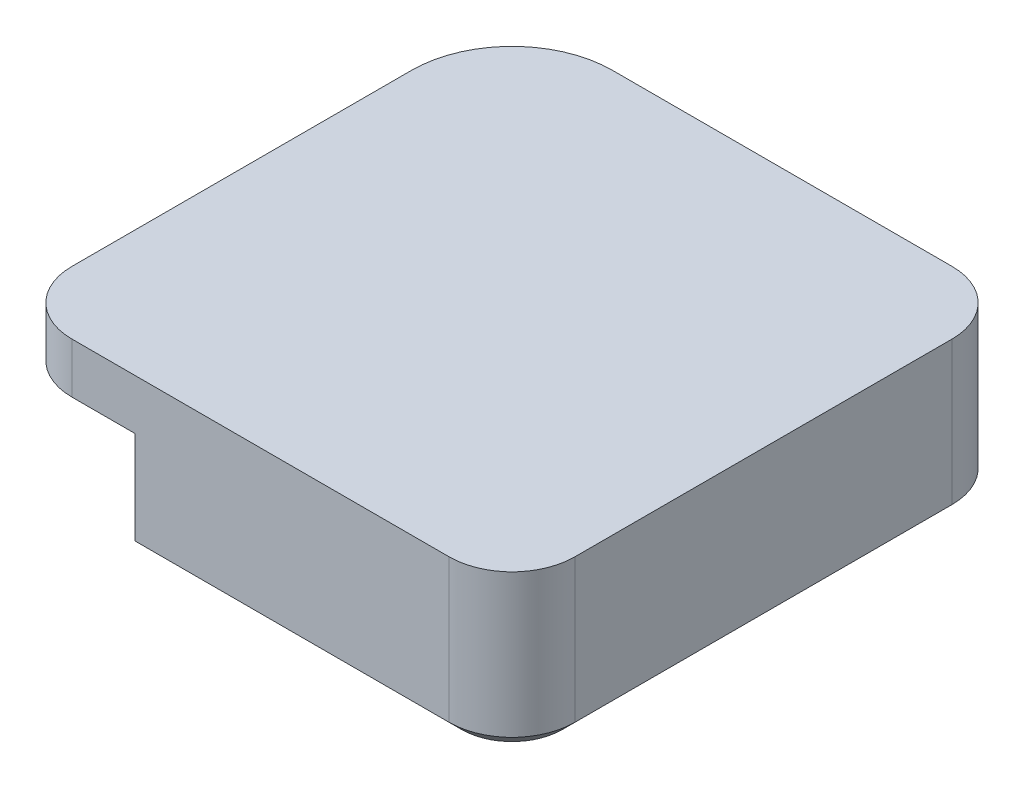
ISO-10303-21;
HEADER;
FILE_DESCRIPTION(('STEP AP214'),'2;1');
FILE_NAME('part.step','',(''),(''),'','','');
FILE_SCHEMA(('AUTOMOTIVE_DESIGN { 1 0 10303 214 1 1 1 1 }'));
ENDSEC;
DATA;
#1=APPLICATION_CONTEXT('core data for automotive mechanical design processes');
#2=APPLICATION_PROTOCOL_DEFINITION('international standard','automotive_design',2000,#1);
#3=PRODUCT_CONTEXT('',#1,'mechanical');
#4=PRODUCT('Part','Part','',(#3));
#5=PRODUCT_RELATED_PRODUCT_CATEGORY('part','',(#4));
#6=PRODUCT_DEFINITION_FORMATION('','',#4);
#7=PRODUCT_DEFINITION_CONTEXT('part definition',#1,'design');
#8=PRODUCT_DEFINITION('design','',#6,#7);
#9=PRODUCT_DEFINITION_SHAPE('','',#8);
#10=(LENGTH_UNIT() NAMED_UNIT(*) SI_UNIT(.MILLI.,.METRE.));
#11=(NAMED_UNIT(*) PLANE_ANGLE_UNIT() SI_UNIT($,.RADIAN.));
#12=(NAMED_UNIT(*) SI_UNIT($,.STERADIAN.) SOLID_ANGLE_UNIT());
#13=UNCERTAINTY_MEASURE_WITH_UNIT(LENGTH_MEASURE(1.E-05),#10,'distance_accuracy_value','');
#14=(GEOMETRIC_REPRESENTATION_CONTEXT(3) GLOBAL_UNCERTAINTY_ASSIGNED_CONTEXT((#13)) GLOBAL_UNIT_ASSIGNED_CONTEXT((#10,
#11,#12)) REPRESENTATION_CONTEXT('',''));
#15=CARTESIAN_POINT('',(0.,0.,0.));
#16=DIRECTION('',(0.,0.,1.));
#17=DIRECTION('',(1.,0.,0.));
#18=AXIS2_PLACEMENT_3D('',#15,#16,#17);
#19=CARTESIAN_POINT('',(0.,4.2,-20.));
#20=DIRECTION('',(0.,0.,-1.));
#21=DIRECTION('',(-1.,0.,0.));
#22=AXIS2_PLACEMENT_3D('',#19,#20,#21);
#23=PLANE('',#22);
#24=DIRECTION('',(0.,-1.,0.));
#25=VECTOR('',#24,1.);
#26=CARTESIAN_POINT('',(17.5,4.2,-20.));
#27=LINE('',#26,#25);
#28=CARTESIAN_POINT('',(17.5,6.2,-20.));
#29=VERTEX_POINT('',#28);
#30=CARTESIAN_POINT('',(17.5,0.5,-20.));
#31=VERTEX_POINT('',#30);
#32=EDGE_CURVE('E198',#29,#31,#27,.T.);
#33=ORIENTED_EDGE('',*,*,#32,.T.);
#34=DIRECTION('',(-1.,0.,0.));
#35=VECTOR('',#34,1.);
#36=CARTESIAN_POINT('',(4.,0.5,-20.));
#37=LINE('',#36,#35);
#38=CARTESIAN_POINT('',(4.,0.5,-20.));
#39=VERTEX_POINT('',#38);
#40=EDGE_CURVE('E272',#31,#39,#37,.T.);
#41=ORIENTED_EDGE('',*,*,#40,.T.);
#42=DIRECTION('',(0.,-1.,0.));
#43=VECTOR('',#42,1.);
#44=CARTESIAN_POINT('',(4.,4.2,-20.));
#45=LINE('',#44,#43);
#46=CARTESIAN_POINT('',(4.,6.2,-20.));
#47=VERTEX_POINT('',#46);
#48=EDGE_CURVE('E215',#47,#39,#45,.T.);
#49=ORIENTED_EDGE('',*,*,#48,.F.);
#50=DIRECTION('',(-1.,0.,0.));
#51=VECTOR('',#50,1.);
#52=CARTESIAN_POINT('',(4.,6.2,-20.));
#53=LINE('',#52,#51);
#54=EDGE_CURVE('E326',#29,#47,#53,.T.);
#55=ORIENTED_EDGE('',*,*,#54,.F.);
#56=EDGE_LOOP('',(#33,#41,#49,#55));
#57=FACE_BOUND('',#56,.T.);
#58=ADVANCED_FACE('F36',(#57),#23,.T.);
#59=CARTESIAN_POINT('',(4.,4.2,-16.));
#60=DIRECTION('',(0.,-1.,0.));
#61=DIRECTION('',(0.,0.,-1.));
#62=AXIS2_PLACEMENT_3D('',#59,#60,#61);
#63=CYLINDRICAL_SURFACE('',#62,4.);
#64=ORIENTED_EDGE('',*,*,#48,.T.);
#65=CARTESIAN_POINT('',(4.,0.5,-16.));
#66=DIRECTION('',(0.,1.,0.));
#67=DIRECTION('',(0.,0.,1.));
#68=AXIS2_PLACEMENT_3D('',#65,#66,#67);
#69=CIRCLE('',#68,4.);
#70=CARTESIAN_POINT('',(0.,0.5,-16.));
#71=VERTEX_POINT('',#70);
#72=EDGE_CURVE('E218',#39,#71,#69,.T.);
#73=ORIENTED_EDGE('',*,*,#72,.T.);
#74=DIRECTION('',(0.,-1.,0.));
#75=VECTOR('',#74,1.);
#76=CARTESIAN_POINT('',(0.,4.2,-16.));
#77=LINE('',#76,#75);
#78=CARTESIAN_POINT('',(0.,6.2,-16.));
#79=VERTEX_POINT('',#78);
#80=EDGE_CURVE('E213',#79,#71,#77,.T.);
#81=ORIENTED_EDGE('',*,*,#80,.F.);
#82=CARTESIAN_POINT('',(4.,6.2,-16.));
#83=DIRECTION('',(0.,1.,0.));
#84=DIRECTION('',(0.,0.,1.));
#85=AXIS2_PLACEMENT_3D('',#82,#83,#84);
#86=CIRCLE('',#85,4.);
#87=EDGE_CURVE('E159',#47,#79,#86,.T.);
#88=ORIENTED_EDGE('',*,*,#87,.F.);
#89=EDGE_LOOP('',(#64,#73,#81,#88));
#90=FACE_BOUND('',#89,.T.);
#91=ADVANCED_FACE('F362',(#90),#63,.T.);
#92=CARTESIAN_POINT('',(0.,4.2,0.));
#93=DIRECTION('',(-1.,0.,0.));
#94=DIRECTION('',(0.,0.,1.));
#95=AXIS2_PLACEMENT_3D('',#92,#93,#94);
#96=PLANE('',#95);
#97=ORIENTED_EDGE('',*,*,#80,.T.);
#98=DIRECTION('',(0.,0.,1.));
#99=VECTOR('',#98,1.);
#100=CARTESIAN_POINT('',(0.,0.5,-5.));
#101=LINE('',#100,#99);
#102=CARTESIAN_POINT('',(0.,0.5,-5.));
#103=VERTEX_POINT('',#102);
#104=EDGE_CURVE('E262',#71,#103,#101,.T.);
#105=ORIENTED_EDGE('',*,*,#104,.T.);
#106=DIRECTION('',(0.,-1.,0.));
#107=VECTOR('',#106,1.);
#108=CARTESIAN_POINT('',(0.,4.2,-5.));
#109=LINE('',#108,#107);
#110=CARTESIAN_POINT('',(0.,4.2,-5.));
#111=VERTEX_POINT('',#110);
#112=EDGE_CURVE('E210',#111,#103,#109,.T.);
#113=ORIENTED_EDGE('',*,*,#112,.F.);
#114=DIRECTION('',(0.,0.,1.));
#115=VECTOR('',#114,1.);
#116=CARTESIAN_POINT('',(0.,4.2,-5.));
#117=LINE('',#116,#115);
#118=CARTESIAN_POINT('',(0.,4.2,-2.50000000000002));
#119=VERTEX_POINT('',#118);
#120=EDGE_CURVE('E162',#111,#119,#117,.T.);
#121=ORIENTED_EDGE('',*,*,#120,.T.);
#122=DIRECTION('',(0.,-1.,0.));
#123=VECTOR('',#122,1.);
#124=CARTESIAN_POINT('',(0.,6.2,-2.50000000000002));
#125=LINE('',#124,#123);
#126=CARTESIAN_POINT('',(0.,6.2,-2.50000000000002));
#127=VERTEX_POINT('',#126);
#128=EDGE_CURVE('E145',#127,#119,#125,.T.);
#129=ORIENTED_EDGE('',*,*,#128,.F.);
#130=DIRECTION('',(0.,0.,1.));
#131=VECTOR('',#130,1.);
#132=CARTESIAN_POINT('',(0.,6.2,-2.50000000000002));
#133=LINE('',#132,#131);
#134=EDGE_CURVE('E152',#79,#127,#133,.T.);
#135=ORIENTED_EDGE('',*,*,#134,.F.);
#136=EDGE_LOOP('',(#97,#105,#113,#121,#129,#135));
#137=FACE_BOUND('',#136,.T.);
#138=ADVANCED_FACE('F164',(#137),#96,.T.);
#139=CARTESIAN_POINT('',(2.5,4.2,-2.5));
#140=DIRECTION('',(-0.707106781186548,0.,0.707106781186548));
#141=DIRECTION('',(0.707106781186548,0.,0.707106781186548));
#142=AXIS2_PLACEMENT_3D('',#139,#140,#141);
#143=PLANE('',#142);
#144=ORIENTED_EDGE('',*,*,#112,.T.);
#145=DIRECTION('',(0.707106781186548,0.,0.707106781186548));
#146=VECTOR('',#145,1.);
#147=CARTESIAN_POINT('',(5.,0.5,0.));
#148=LINE('',#147,#146);
#149=CARTESIAN_POINT('',(5.,0.5,0.));
#150=VERTEX_POINT('',#149);
#151=EDGE_CURVE('E264',#103,#150,#148,.T.);
#152=ORIENTED_EDGE('',*,*,#151,.T.);
#153=DIRECTION('',(0.,-1.,0.));
#154=VECTOR('',#153,1.);
#155=CARTESIAN_POINT('',(5.,4.2,0.));
#156=LINE('',#155,#154);
#157=CARTESIAN_POINT('',(5.00000000000001,4.2,0.));
#158=VERTEX_POINT('',#157);
#159=EDGE_CURVE('E207',#158,#150,#156,.T.);
#160=ORIENTED_EDGE('',*,*,#159,.F.);
#161=DIRECTION('',(-0.707106781186548,0.,-0.707106781186548));
#162=VECTOR('',#161,1.);
#163=CARTESIAN_POINT('',(2.5,4.2,-2.5));
#164=LINE('',#163,#162);
#165=EDGE_CURVE('E178',#158,#111,#164,.T.);
#166=ORIENTED_EDGE('',*,*,#165,.T.);
#167=EDGE_LOOP('',(#144,#152,#160,#166));
#168=FACE_BOUND('',#167,.T.);
#169=ADVANCED_FACE('F368',(#168),#143,.T.);
#170=CARTESIAN_POINT('',(0.,4.2,0.));
#171=DIRECTION('',(0.,0.,-1.));
#172=DIRECTION('',(-1.,0.,0.));
#173=AXIS2_PLACEMENT_3D('',#170,#171,#172);
#174=PLANE('',#173);
#175=ORIENTED_EDGE('',*,*,#159,.T.);
#176=DIRECTION('',(1.,0.,0.));
#177=VECTOR('',#176,1.);
#178=CARTESIAN_POINT('',(0.,0.5,0.));
#179=LINE('',#178,#177);
#180=CARTESIAN_POINT('',(17.5,0.5,0.));
#181=VERTEX_POINT('',#180);
#182=EDGE_CURVE('E266',#150,#181,#179,.T.);
#183=ORIENTED_EDGE('',*,*,#182,.T.);
#184=DIRECTION('',(0.,-1.,0.));
#185=VECTOR('',#184,1.);
#186=CARTESIAN_POINT('',(17.5,4.2,0.));
#187=LINE('',#186,#185);
#188=CARTESIAN_POINT('',(17.5,6.2,0.));
#189=VERTEX_POINT('',#188);
#190=EDGE_CURVE('E204',#189,#181,#187,.T.);
#191=ORIENTED_EDGE('',*,*,#190,.F.);
#192=DIRECTION('',(1.,0.,0.));
#193=VECTOR('',#192,1.);
#194=CARTESIAN_POINT('',(17.5,6.2,0.));
#195=LINE('',#194,#193);
#196=CARTESIAN_POINT('',(2.50000000000002,6.2,0.));
#197=VERTEX_POINT('',#196);
#198=EDGE_CURVE('E151',#197,#189,#195,.T.);
#199=ORIENTED_EDGE('',*,*,#198,.F.);
#200=DIRECTION('',(0.,-1.,0.));
#201=VECTOR('',#200,1.);
#202=CARTESIAN_POINT('',(2.50000000000002,6.2,0.));
#203=LINE('',#202,#201);
#204=CARTESIAN_POINT('',(2.50000000000002,4.2,0.));
#205=VERTEX_POINT('',#204);
#206=EDGE_CURVE('E147',#197,#205,#203,.T.);
#207=ORIENTED_EDGE('',*,*,#206,.T.);
#208=DIRECTION('',(1.,0.,0.));
#209=VECTOR('',#208,1.);
#210=CARTESIAN_POINT('',(17.5,4.2,0.));
#211=LINE('',#210,#209);
#212=EDGE_CURVE('E320',#205,#158,#211,.T.);
#213=ORIENTED_EDGE('',*,*,#212,.T.);
#214=EDGE_LOOP('',(#175,#183,#191,#199,#207,#213));
#215=FACE_BOUND('',#214,.T.);
#216=ADVANCED_FACE('F384',(#215),#174,.F.);
#217=CARTESIAN_POINT('',(17.5,4.2,-2.5));
#218=DIRECTION('',(0.,-1.,0.));
#219=DIRECTION('',(0.,0.,-1.));
#220=AXIS2_PLACEMENT_3D('',#217,#218,#219);
#221=CYLINDRICAL_SURFACE('',#220,2.5);
#222=ORIENTED_EDGE('',*,*,#190,.T.);
#223=CARTESIAN_POINT('',(17.5,0.5,-2.5));
#224=DIRECTION('',(0.,1.,0.));
#225=DIRECTION('',(0.,0.,1.));
#226=AXIS2_PLACEMENT_3D('',#223,#224,#225);
#227=CIRCLE('',#226,2.5);
#228=CARTESIAN_POINT('',(20.,0.5,-2.50000000000002));
#229=VERTEX_POINT('',#228);
#230=EDGE_CURVE('E268',#181,#229,#227,.T.);
#231=ORIENTED_EDGE('',*,*,#230,.T.);
#232=DIRECTION('',(0.,-1.,0.));
#233=VECTOR('',#232,1.);
#234=CARTESIAN_POINT('',(20.,4.2,-2.50000000000002));
#235=LINE('',#234,#233);
#236=CARTESIAN_POINT('',(20.,6.2,-2.50000000000002));
#237=VERTEX_POINT('',#236);
#238=EDGE_CURVE('E202',#237,#229,#235,.T.);
#239=ORIENTED_EDGE('',*,*,#238,.F.);
#240=CARTESIAN_POINT('',(17.5,6.2,-2.5));
#241=DIRECTION('',(0.,1.,0.));
#242=DIRECTION('',(0.,0.,1.));
#243=AXIS2_PLACEMENT_3D('',#240,#241,#242);
#244=CIRCLE('',#243,2.5);
#245=EDGE_CURVE('E334',#189,#237,#244,.T.);
#246=ORIENTED_EDGE('',*,*,#245,.F.);
#247=EDGE_LOOP('',(#222,#231,#239,#246));
#248=FACE_BOUND('',#247,.T.);
#249=ADVANCED_FACE('F341',(#248),#221,.T.);
#250=CARTESIAN_POINT('',(20.,4.2,0.));
#251=DIRECTION('',(-1.,0.,0.));
#252=DIRECTION('',(0.,0.,1.));
#253=AXIS2_PLACEMENT_3D('',#250,#251,#252);
#254=PLANE('',#253);
#255=ORIENTED_EDGE('',*,*,#238,.T.);
#256=DIRECTION('',(0.,0.,-1.));
#257=VECTOR('',#256,1.);
#258=CARTESIAN_POINT('',(20.,0.5,0.));
#259=LINE('',#258,#257);
#260=CARTESIAN_POINT('',(20.,0.5,-17.5));
#261=VERTEX_POINT('',#260);
#262=EDGE_CURVE('E62',#229,#261,#259,.T.);
#263=ORIENTED_EDGE('',*,*,#262,.T.);
#264=DIRECTION('',(0.,-1.,0.));
#265=VECTOR('',#264,1.);
#266=CARTESIAN_POINT('',(20.,4.2,-17.5));
#267=LINE('',#266,#265);
#268=CARTESIAN_POINT('',(20.,6.2,-17.5));
#269=VERTEX_POINT('',#268);
#270=EDGE_CURVE('E200',#269,#261,#267,.T.);
#271=ORIENTED_EDGE('',*,*,#270,.F.);
#272=DIRECTION('',(0.,0.,-1.));
#273=VECTOR('',#272,1.);
#274=CARTESIAN_POINT('',(20.,6.2,-17.5));
#275=LINE('',#274,#273);
#276=EDGE_CURVE('E331',#237,#269,#275,.T.);
#277=ORIENTED_EDGE('',*,*,#276,.F.);
#278=EDGE_LOOP('',(#255,#263,#271,#277));
#279=FACE_BOUND('',#278,.T.);
#280=ADVANCED_FACE('F343',(#279),#254,.F.);
#281=CARTESIAN_POINT('',(4.,4.2,-16.));
#282=DIRECTION('',(0.,-1.,0.));
#283=DIRECTION('',(0.,0.,-1.));
#284=AXIS2_PLACEMENT_3D('',#281,#282,#283);
#285=CYLINDRICAL_SURFACE('',#284,1.75);
#286=CARTESIAN_POINT('',(4.,0.500000000000002,-16.));
#287=DIRECTION('',(0.,1.,0.));
#288=DIRECTION('',(0.,0.,1.));
#289=AXIS2_PLACEMENT_3D('',#286,#287,#288);
#290=CIRCLE('',#289,1.75);
#291=CARTESIAN_POINT('',(4.,0.500000000000002,-14.25));
#292=VERTEX_POINT('',#291);
#293=EDGE_CURVE('E274',#292,#292,#290,.F.);
#294=ORIENTED_EDGE('',*,*,#293,.T.);
#295=EDGE_LOOP('',(#294));
#296=FACE_BOUND('',#295,.T.);
#297=CARTESIAN_POINT('',(4.,4.2,-16.));
#298=DIRECTION('',(0.,1.,0.));
#299=DIRECTION('',(0.,0.,1.));
#300=AXIS2_PLACEMENT_3D('',#297,#298,#299);
#301=CIRCLE('',#300,1.75);
#302=CARTESIAN_POINT('',(4.,4.2,-14.25));
#303=VERTEX_POINT('',#302);
#304=EDGE_CURVE('E167',#303,#303,#301,.T.);
#305=ORIENTED_EDGE('',*,*,#304,.T.);
#306=EDGE_LOOP('',(#305));
#307=FACE_BOUND('',#306,.T.);
#308=ADVANCED_FACE('F414',(#296,#307),#285,.F.);
#309=CARTESIAN_POINT('',(10.,4.2,-16.));
#310=DIRECTION('',(0.,-1.,0.));
#311=DIRECTION('',(0.,0.,-1.));
#312=AXIS2_PLACEMENT_3D('',#309,#310,#311);
#313=CYLINDRICAL_SURFACE('',#312,1.8);
#314=CARTESIAN_POINT('',(10.,0.500000000000003,-16.));
#315=DIRECTION('',(0.,1.,0.));
#316=DIRECTION('',(0.,0.,1.));
#317=AXIS2_PLACEMENT_3D('',#314,#315,#316);
#318=CIRCLE('',#317,1.8);
#319=CARTESIAN_POINT('',(10.,0.500000000000003,-14.2));
#320=VERTEX_POINT('',#319);
#321=EDGE_CURVE('E277',#320,#320,#318,.F.);
#322=ORIENTED_EDGE('',*,*,#321,.T.);
#323=EDGE_LOOP('',(#322));
#324=FACE_BOUND('',#323,.T.);
#325=CARTESIAN_POINT('',(10.,4.2,-16.));
#326=DIRECTION('',(0.,1.,0.));
#327=DIRECTION('',(0.,0.,1.));
#328=AXIS2_PLACEMENT_3D('',#325,#326,#327);
#329=CIRCLE('',#328,1.8);
#330=CARTESIAN_POINT('',(10.,4.2,-14.2));
#331=VERTEX_POINT('',#330);
#332=EDGE_CURVE('E170',#331,#331,#329,.T.);
#333=ORIENTED_EDGE('',*,*,#332,.T.);
#334=EDGE_LOOP('',(#333));
#335=FACE_BOUND('',#334,.T.);
#336=ADVANCED_FACE('F417',(#324,#335),#313,.F.);
#337=CARTESIAN_POINT('',(16.,4.2,-16.));
#338=DIRECTION('',(0.,-1.,0.));
#339=DIRECTION('',(0.,0.,-1.));
#340=AXIS2_PLACEMENT_3D('',#337,#338,#339);
#341=CYLINDRICAL_SURFACE('',#340,1.85);
#342=CARTESIAN_POINT('',(16.,0.500000000000002,-16.));
#343=DIRECTION('',(0.,1.,0.));
#344=DIRECTION('',(0.,0.,1.));
#345=AXIS2_PLACEMENT_3D('',#342,#343,#344);
#346=CIRCLE('',#345,1.85);
#347=CARTESIAN_POINT('',(16.,0.500000000000002,-14.15));
#348=VERTEX_POINT('',#347);
#349=EDGE_CURVE('E280',#348,#348,#346,.F.);
#350=ORIENTED_EDGE('',*,*,#349,.T.);
#351=EDGE_LOOP('',(#350));
#352=FACE_BOUND('',#351,.T.);
#353=CARTESIAN_POINT('',(16.,4.2,-16.));
#354=DIRECTION('',(0.,1.,0.));
#355=DIRECTION('',(0.,0.,1.));
#356=AXIS2_PLACEMENT_3D('',#353,#354,#355);
#357=CIRCLE('',#356,1.85);
#358=CARTESIAN_POINT('',(16.,4.2,-14.15));
#359=VERTEX_POINT('',#358);
#360=EDGE_CURVE('E191',#359,#359,#357,.T.);
#361=ORIENTED_EDGE('',*,*,#360,.T.);
#362=EDGE_LOOP('',(#361));
#363=FACE_BOUND('',#362,.T.);
#364=ADVANCED_FACE('F421',(#352,#363),#341,.F.);
#365=CARTESIAN_POINT('',(4.,4.2,-10.));
#366=DIRECTION('',(0.,-1.,0.));
#367=DIRECTION('',(0.,0.,-1.));
#368=AXIS2_PLACEMENT_3D('',#365,#366,#367);
#369=CYLINDRICAL_SURFACE('',#368,1.9);
#370=CARTESIAN_POINT('',(4.,0.500000000000006,-10.));
#371=DIRECTION('',(0.,1.,0.));
#372=DIRECTION('',(0.,0.,1.));
#373=AXIS2_PLACEMENT_3D('',#370,#371,#372);
#374=CIRCLE('',#373,1.9);
#375=CARTESIAN_POINT('',(4.,0.500000000000006,-8.1));
#376=VERTEX_POINT('',#375);
#377=EDGE_CURVE('E283',#376,#376,#374,.F.);
#378=ORIENTED_EDGE('',*,*,#377,.T.);
#379=EDGE_LOOP('',(#378));
#380=FACE_BOUND('',#379,.T.);
#381=CARTESIAN_POINT('',(4.,4.2,-10.));
#382=DIRECTION('',(0.,1.,0.));
#383=DIRECTION('',(0.,0.,1.));
#384=AXIS2_PLACEMENT_3D('',#381,#382,#383);
#385=CIRCLE('',#384,1.9);
#386=CARTESIAN_POINT('',(4.,4.2,-8.1));
#387=VERTEX_POINT('',#386);
#388=EDGE_CURVE('E188',#387,#387,#385,.T.);
#389=ORIENTED_EDGE('',*,*,#388,.T.);
#390=EDGE_LOOP('',(#389));
#391=FACE_BOUND('',#390,.T.);
#392=ADVANCED_FACE('F425',(#380,#391),#369,.F.);
#393=CARTESIAN_POINT('',(10.,4.2,-10.));
#394=DIRECTION('',(0.,-1.,0.));
#395=DIRECTION('',(0.,0.,-1.));
#396=AXIS2_PLACEMENT_3D('',#393,#394,#395);
#397=CYLINDRICAL_SURFACE('',#396,1.95);
#398=CARTESIAN_POINT('',(10.,0.500000000000004,-10.));
#399=DIRECTION('',(0.,1.,0.));
#400=DIRECTION('',(0.,0.,1.));
#401=AXIS2_PLACEMENT_3D('',#398,#399,#400);
#402=CIRCLE('',#401,1.95);
#403=CARTESIAN_POINT('',(10.,0.500000000000004,-8.05));
#404=VERTEX_POINT('',#403);
#405=EDGE_CURVE('E286',#404,#404,#402,.F.);
#406=ORIENTED_EDGE('',*,*,#405,.T.);
#407=EDGE_LOOP('',(#406));
#408=FACE_BOUND('',#407,.T.);
#409=CARTESIAN_POINT('',(10.,4.2,-10.));
#410=DIRECTION('',(0.,1.,0.));
#411=DIRECTION('',(0.,0.,1.));
#412=AXIS2_PLACEMENT_3D('',#409,#410,#411);
#413=CIRCLE('',#412,1.95);
#414=CARTESIAN_POINT('',(10.,4.2,-8.05));
#415=VERTEX_POINT('',#414);
#416=EDGE_CURVE('E185',#415,#415,#413,.T.);
#417=ORIENTED_EDGE('',*,*,#416,.T.);
#418=EDGE_LOOP('',(#417));
#419=FACE_BOUND('',#418,.T.);
#420=ADVANCED_FACE('F429',(#408,#419),#397,.F.);
#421=CARTESIAN_POINT('',(16.,4.2,-10.));
#422=DIRECTION('',(0.,-1.,0.));
#423=DIRECTION('',(0.,0.,-1.));
#424=AXIS2_PLACEMENT_3D('',#421,#422,#423);
#425=CYLINDRICAL_SURFACE('',#424,2.);
#426=CARTESIAN_POINT('',(16.,0.500000000000003,-10.));
#427=DIRECTION('',(0.,1.,0.));
#428=DIRECTION('',(0.,0.,1.));
#429=AXIS2_PLACEMENT_3D('',#426,#427,#428);
#430=CIRCLE('',#429,2.);
#431=CARTESIAN_POINT('',(16.,0.500000000000003,-8.));
#432=VERTEX_POINT('',#431);
#433=EDGE_CURVE('E289',#432,#432,#430,.F.);
#434=ORIENTED_EDGE('',*,*,#433,.T.);
#435=EDGE_LOOP('',(#434));
#436=FACE_BOUND('',#435,.T.);
#437=CARTESIAN_POINT('',(16.,4.2,-10.));
#438=DIRECTION('',(0.,1.,0.));
#439=DIRECTION('',(0.,0.,1.));
#440=AXIS2_PLACEMENT_3D('',#437,#438,#439);
#441=CIRCLE('',#440,2.);
#442=CARTESIAN_POINT('',(16.,4.2,-8.));
#443=VERTEX_POINT('',#442);
#444=EDGE_CURVE('E182',#443,#443,#441,.T.);
#445=ORIENTED_EDGE('',*,*,#444,.T.);
#446=EDGE_LOOP('',(#445));
#447=FACE_BOUND('',#446,.T.);
#448=ADVANCED_FACE('F433',(#436,#447),#425,.F.);
#449=CARTESIAN_POINT('',(10.,4.2,-4.));
#450=DIRECTION('',(0.,-1.,0.));
#451=DIRECTION('',(0.,0.,-1.));
#452=AXIS2_PLACEMENT_3D('',#449,#450,#451);
#453=CYLINDRICAL_SURFACE('',#452,2.05);
#454=CARTESIAN_POINT('',(10.,0.500000000000003,-4.));
#455=DIRECTION('',(0.,1.,0.));
#456=DIRECTION('',(0.,0.,1.));
#457=AXIS2_PLACEMENT_3D('',#454,#455,#456);
#458=CIRCLE('',#457,2.05);
#459=CARTESIAN_POINT('',(10.,0.500000000000003,-1.95));
#460=VERTEX_POINT('',#459);
#461=EDGE_CURVE('E46',#460,#460,#458,.F.);
#462=ORIENTED_EDGE('',*,*,#461,.T.);
#463=EDGE_LOOP('',(#462));
#464=FACE_BOUND('',#463,.T.);
#465=CARTESIAN_POINT('',(10.,4.2,-4.));
#466=DIRECTION('',(0.,1.,0.));
#467=DIRECTION('',(0.,0.,1.));
#468=AXIS2_PLACEMENT_3D('',#465,#466,#467);
#469=CIRCLE('',#468,2.05);
#470=CARTESIAN_POINT('',(10.,4.2,-1.95));
#471=VERTEX_POINT('',#470);
#472=EDGE_CURVE('E179',#471,#471,#469,.T.);
#473=ORIENTED_EDGE('',*,*,#472,.T.);
#474=EDGE_LOOP('',(#473));
#475=FACE_BOUND('',#474,.T.);
#476=ADVANCED_FACE('F437',(#464,#475),#453,.F.);
#477=CARTESIAN_POINT('',(16.,4.2,-4.));
#478=DIRECTION('',(0.,-1.,0.));
#479=DIRECTION('',(0.,0.,-1.));
#480=AXIS2_PLACEMENT_3D('',#477,#478,#479);
#481=CYLINDRICAL_SURFACE('',#480,2.1);
#482=CARTESIAN_POINT('',(16.,0.500000000000004,-4.));
#483=DIRECTION('',(0.,1.,0.));
#484=DIRECTION('',(0.,0.,1.));
#485=AXIS2_PLACEMENT_3D('',#482,#483,#484);
#486=CIRCLE('',#485,2.1);
#487=CARTESIAN_POINT('',(16.,0.500000000000004,-1.9));
#488=VERTEX_POINT('',#487);
#489=EDGE_CURVE('E11',#488,#488,#486,.F.);
#490=ORIENTED_EDGE('',*,*,#489,.T.);
#491=EDGE_LOOP('',(#490));
#492=FACE_BOUND('',#491,.T.);
#493=CARTESIAN_POINT('',(16.,4.2,-4.));
#494=DIRECTION('',(0.,1.,0.));
#495=DIRECTION('',(0.,0.,1.));
#496=AXIS2_PLACEMENT_3D('',#493,#494,#495);
#497=CIRCLE('',#496,2.1);
#498=CARTESIAN_POINT('',(16.,4.2,-1.9));
#499=VERTEX_POINT('',#498);
#500=EDGE_CURVE('E175',#499,#499,#497,.T.);
#501=ORIENTED_EDGE('',*,*,#500,.T.);
#502=EDGE_LOOP('',(#501));
#503=FACE_BOUND('',#502,.T.);
#504=ADVANCED_FACE('F441',(#492,#503),#481,.F.);
#505=CARTESIAN_POINT('',(17.5,4.2,-17.5));
#506=DIRECTION('',(0.,-1.,0.));
#507=DIRECTION('',(0.,0.,-1.));
#508=AXIS2_PLACEMENT_3D('',#505,#506,#507);
#509=CYLINDRICAL_SURFACE('',#508,2.5);
#510=ORIENTED_EDGE('',*,*,#270,.T.);
#511=CARTESIAN_POINT('',(17.5,0.5,-17.5));
#512=DIRECTION('',(0.,1.,0.));
#513=DIRECTION('',(0.,0.,1.));
#514=AXIS2_PLACEMENT_3D('',#511,#512,#513);
#515=CIRCLE('',#514,2.5);
#516=EDGE_CURVE('E54',#261,#31,#515,.T.);
#517=ORIENTED_EDGE('',*,*,#516,.T.);
#518=ORIENTED_EDGE('',*,*,#32,.F.);
#519=CARTESIAN_POINT('',(17.5,6.2,-17.5));
#520=DIRECTION('',(0.,1.,0.));
#521=DIRECTION('',(0.,0.,-1.));
#522=AXIS2_PLACEMENT_3D('',#519,#520,#521);
#523=CIRCLE('',#522,2.5);
#524=EDGE_CURVE('E328',#269,#29,#523,.T.);
#525=ORIENTED_EDGE('',*,*,#524,.F.);
#526=EDGE_LOOP('',(#510,#517,#518,#525));
#527=FACE_BOUND('',#526,.T.);
#528=ADVANCED_FACE('F397',(#527),#509,.T.);
#529=CARTESIAN_POINT('',(0.,0.,0.));
#530=DIRECTION('',(0.,1.,0.));
#531=DIRECTION('',(0.,0.,1.));
#532=AXIS2_PLACEMENT_3D('',#529,#530,#531);
#533=PLANE('',#532);
#534=DIRECTION('',(0.,0.,-1.));
#535=VECTOR('',#534,1.);
#536=CARTESIAN_POINT('',(0.499999999999994,0.,-16.));
#537=LINE('',#536,#535);
#538=CARTESIAN_POINT('',(0.499999999999993,0.,-5.20710678118654));
#539=VERTEX_POINT('',#538);
#540=CARTESIAN_POINT('',(0.499999999999994,0.,-16.));
#541=VERTEX_POINT('',#540);
#542=EDGE_CURVE('E257',#539,#541,#537,.T.);
#543=ORIENTED_EDGE('',*,*,#542,.T.);
#544=CARTESIAN_POINT('',(4.,0.,-16.));
#545=DIRECTION('',(0.,1.,0.));
#546=DIRECTION('',(0.,0.,1.));
#547=AXIS2_PLACEMENT_3D('',#544,#545,#546);
#548=CIRCLE('',#547,3.50000000000001);
#549=CARTESIAN_POINT('',(4.,0.,-19.5));
#550=VERTEX_POINT('',#549);
#551=EDGE_CURVE('E259',#541,#550,#548,.F.);
#552=ORIENTED_EDGE('',*,*,#551,.T.);
#553=DIRECTION('',(1.,0.,0.));
#554=VECTOR('',#553,1.);
#555=CARTESIAN_POINT('',(17.5,0.,-19.5));
#556=LINE('',#555,#554);
#557=CARTESIAN_POINT('',(17.5,0.,-19.5));
#558=VERTEX_POINT('',#557);
#559=EDGE_CURVE('E245',#550,#558,#556,.T.);
#560=ORIENTED_EDGE('',*,*,#559,.T.);
#561=CARTESIAN_POINT('',(17.5,0.,-17.5));
#562=DIRECTION('',(0.,1.,0.));
#563=DIRECTION('',(0.,0.,1.));
#564=AXIS2_PLACEMENT_3D('',#561,#562,#563);
#565=CIRCLE('',#564,2.00000000000001);
#566=CARTESIAN_POINT('',(19.5,0.,-17.5));
#567=VERTEX_POINT('',#566);
#568=EDGE_CURVE('E247',#558,#567,#565,.F.);
#569=ORIENTED_EDGE('',*,*,#568,.T.);
#570=DIRECTION('',(0.,0.,1.));
#571=VECTOR('',#570,1.);
#572=CARTESIAN_POINT('',(19.5,0.,0.));
#573=LINE('',#572,#571);
#574=CARTESIAN_POINT('',(19.5,0.,-2.50000000000001));
#575=VERTEX_POINT('',#574);
#576=EDGE_CURVE('E249',#567,#575,#573,.T.);
#577=ORIENTED_EDGE('',*,*,#576,.T.);
#578=CARTESIAN_POINT('',(17.5,0.,-2.5));
#579=DIRECTION('',(0.,1.,0.));
#580=DIRECTION('',(0.,0.,1.));
#581=AXIS2_PLACEMENT_3D('',#578,#579,#580);
#582=CIRCLE('',#581,2.00000000000001);
#583=CARTESIAN_POINT('',(17.5,0.,-0.499999999999994));
#584=VERTEX_POINT('',#583);
#585=EDGE_CURVE('E251',#575,#584,#582,.F.);
#586=ORIENTED_EDGE('',*,*,#585,.T.);
#587=DIRECTION('',(-1.,0.,0.));
#588=VECTOR('',#587,1.);
#589=CARTESIAN_POINT('',(0.,0.,-0.499999999999994));
#590=LINE('',#589,#588);
#591=CARTESIAN_POINT('',(5.20710678118654,0.,-0.499999999999994));
#592=VERTEX_POINT('',#591);
#593=EDGE_CURVE('E253',#584,#592,#590,.T.);
#594=ORIENTED_EDGE('',*,*,#593,.T.);
#595=DIRECTION('',(-0.707106781186548,0.,-0.707106781186548));
#596=VECTOR('',#595,1.);
#597=CARTESIAN_POINT('',(0.35355339059327,0.,-5.35355339059327));
#598=LINE('',#597,#596);
#599=EDGE_CURVE('E255',#592,#539,#598,.T.);
#600=ORIENTED_EDGE('',*,*,#599,.T.);
#601=EDGE_LOOP('',(#543,#552,#560,#569,#577,#586,#594,#600));
#602=FACE_BOUND('',#601,.T.);
#603=CARTESIAN_POINT('',(4.,0.,-16.));
#604=DIRECTION('',(0.,1.,0.));
#605=DIRECTION('',(0.,0.,1.));
#606=AXIS2_PLACEMENT_3D('',#603,#604,#605);
#607=CIRCLE('',#606,2.25);
#608=CARTESIAN_POINT('',(4.,0.,-13.75));
#609=VERTEX_POINT('',#608);
#610=EDGE_CURVE('E242',#609,#609,#607,.T.);
#611=ORIENTED_EDGE('',*,*,#610,.T.);
#612=EDGE_LOOP('',(#611));
#613=FACE_BOUND('',#612,.T.);
#614=CARTESIAN_POINT('',(10.,0.,-16.));
#615=DIRECTION('',(0.,1.,0.));
#616=DIRECTION('',(0.,0.,1.));
#617=AXIS2_PLACEMENT_3D('',#614,#615,#616);
#618=CIRCLE('',#617,2.3);
#619=CARTESIAN_POINT('',(10.,0.,-13.7));
#620=VERTEX_POINT('',#619);
#621=EDGE_CURVE('E239',#620,#620,#618,.T.);
#622=ORIENTED_EDGE('',*,*,#621,.T.);
#623=EDGE_LOOP('',(#622));
#624=FACE_BOUND('',#623,.T.);
#625=CARTESIAN_POINT('',(16.,0.,-16.));
#626=DIRECTION('',(0.,1.,0.));
#627=DIRECTION('',(0.,0.,1.));
#628=AXIS2_PLACEMENT_3D('',#625,#626,#627);
#629=CIRCLE('',#628,2.34999999999999);
#630=CARTESIAN_POINT('',(16.,0.,-13.65));
#631=VERTEX_POINT('',#630);
#632=EDGE_CURVE('E236',#631,#631,#629,.T.);
#633=ORIENTED_EDGE('',*,*,#632,.T.);
#634=EDGE_LOOP('',(#633));
#635=FACE_BOUND('',#634,.T.);
#636=CARTESIAN_POINT('',(4.,0.,-10.));
#637=DIRECTION('',(0.,1.,0.));
#638=DIRECTION('',(0.,0.,1.));
#639=AXIS2_PLACEMENT_3D('',#636,#637,#638);
#640=CIRCLE('',#639,2.4);
#641=CARTESIAN_POINT('',(4.,0.,-7.6));
#642=VERTEX_POINT('',#641);
#643=EDGE_CURVE('E233',#642,#642,#640,.T.);
#644=ORIENTED_EDGE('',*,*,#643,.T.);
#645=EDGE_LOOP('',(#644));
#646=FACE_BOUND('',#645,.T.);
#647=CARTESIAN_POINT('',(10.,0.,-10.));
#648=DIRECTION('',(0.,1.,0.));
#649=DIRECTION('',(0.,0.,1.));
#650=AXIS2_PLACEMENT_3D('',#647,#648,#649);
#651=CIRCLE('',#650,2.45);
#652=CARTESIAN_POINT('',(10.,0.,-7.55));
#653=VERTEX_POINT('',#652);
#654=EDGE_CURVE('E230',#653,#653,#651,.T.);
#655=ORIENTED_EDGE('',*,*,#654,.T.);
#656=EDGE_LOOP('',(#655));
#657=FACE_BOUND('',#656,.T.);
#658=CARTESIAN_POINT('',(16.,0.,-10.));
#659=DIRECTION('',(0.,1.,0.));
#660=DIRECTION('',(0.,0.,1.));
#661=AXIS2_PLACEMENT_3D('',#658,#659,#660);
#662=CIRCLE('',#661,2.5);
#663=CARTESIAN_POINT('',(16.,0.,-7.5));
#664=VERTEX_POINT('',#663);
#665=EDGE_CURVE('E227',#664,#664,#662,.T.);
#666=ORIENTED_EDGE('',*,*,#665,.T.);
#667=EDGE_LOOP('',(#666));
#668=FACE_BOUND('',#667,.T.);
#669=CARTESIAN_POINT('',(10.,0.,-4.));
#670=DIRECTION('',(0.,1.,0.));
#671=DIRECTION('',(0.,0.,1.));
#672=AXIS2_PLACEMENT_3D('',#669,#670,#671);
#673=CIRCLE('',#672,2.55);
#674=CARTESIAN_POINT('',(10.,0.,-1.45));
#675=VERTEX_POINT('',#674);
#676=EDGE_CURVE('E224',#675,#675,#673,.T.);
#677=ORIENTED_EDGE('',*,*,#676,.T.);
#678=EDGE_LOOP('',(#677));
#679=FACE_BOUND('',#678,.T.);
#680=CARTESIAN_POINT('',(16.,0.,-4.));
#681=DIRECTION('',(0.,1.,0.));
#682=DIRECTION('',(0.,0.,1.));
#683=AXIS2_PLACEMENT_3D('',#680,#681,#682);
#684=CIRCLE('',#683,2.6);
#685=CARTESIAN_POINT('',(16.,0.,-1.4));
#686=VERTEX_POINT('',#685);
#687=EDGE_CURVE('E221',#686,#686,#684,.T.);
#688=ORIENTED_EDGE('',*,*,#687,.T.);
#689=EDGE_LOOP('',(#688));
#690=FACE_BOUND('',#689,.T.);
#691=ADVANCED_FACE('F379',(#602,#613,#624,#635,#646,#657,#668,#679,#690),#533,.F.);
#692=CARTESIAN_POINT('',(4.,4.2,-16.));
#693=DIRECTION('',(0.,1.,0.));
#694=DIRECTION('',(0.,0.,1.));
#695=AXIS2_PLACEMENT_3D('',#692,#693,#694);
#696=PLANE('',#695);
#697=ORIENTED_EDGE('',*,*,#165,.F.);
#698=ORIENTED_EDGE('',*,*,#212,.F.);
#699=CARTESIAN_POINT('',(2.5,4.2,-2.5));
#700=DIRECTION('',(0.,1.,0.));
#701=DIRECTION('',(0.,0.,1.));
#702=AXIS2_PLACEMENT_3D('',#699,#700,#701);
#703=CIRCLE('',#702,2.5);
#704=EDGE_CURVE('E316',#119,#205,#703,.T.);
#705=ORIENTED_EDGE('',*,*,#704,.F.);
#706=ORIENTED_EDGE('',*,*,#120,.F.);
#707=EDGE_LOOP('',(#697,#698,#705,#706));
#708=FACE_BOUND('',#707,.T.);
#709=ADVANCED_FACE('F387',(#708),#696,.F.);
#710=CARTESIAN_POINT('',(4.,6.2,-16.));
#711=DIRECTION('',(0.,1.,0.));
#712=DIRECTION('',(0.,0.,1.));
#713=AXIS2_PLACEMENT_3D('',#710,#711,#712);
#714=PLANE('',#713);
#715=ORIENTED_EDGE('',*,*,#134,.T.);
#716=CARTESIAN_POINT('',(2.5,6.2,-2.5));
#717=DIRECTION('',(0.,1.,0.));
#718=DIRECTION('',(0.,0.,1.));
#719=AXIS2_PLACEMENT_3D('',#716,#717,#718);
#720=CIRCLE('',#719,2.5);
#721=EDGE_CURVE('E141',#127,#197,#720,.T.);
#722=ORIENTED_EDGE('',*,*,#721,.T.);
#723=ORIENTED_EDGE('',*,*,#198,.T.);
#724=ORIENTED_EDGE('',*,*,#245,.T.);
#725=ORIENTED_EDGE('',*,*,#276,.T.);
#726=ORIENTED_EDGE('',*,*,#524,.T.);
#727=ORIENTED_EDGE('',*,*,#54,.T.);
#728=ORIENTED_EDGE('',*,*,#87,.T.);
#729=EDGE_LOOP('',(#715,#722,#723,#724,#725,#726,#727,#728));
#730=FACE_BOUND('',#729,.T.);
#731=ADVANCED_FACE('F156',(#730),#714,.T.);
#732=CARTESIAN_POINT('',(2.5,6.2,-2.5));
#733=DIRECTION('',(0.,-1.,0.));
#734=DIRECTION('',(0.,0.,-1.));
#735=AXIS2_PLACEMENT_3D('',#732,#733,#734);
#736=CYLINDRICAL_SURFACE('',#735,2.5);
#737=ORIENTED_EDGE('',*,*,#704,.T.);
#738=ORIENTED_EDGE('',*,*,#206,.F.);
#739=ORIENTED_EDGE('',*,*,#721,.F.);
#740=ORIENTED_EDGE('',*,*,#128,.T.);
#741=EDGE_LOOP('',(#737,#738,#739,#740));
#742=FACE_BOUND('',#741,.T.);
#743=ADVANCED_FACE('F143',(#742),#736,.T.);
#744=ORIENTED_EDGE('',*,*,#304,.F.);
#745=EDGE_LOOP('',(#744));
#746=FACE_BOUND('',#745,.T.);
#747=ADVANCED_FACE('F391',(#746),#696,.F.);
#748=ORIENTED_EDGE('',*,*,#332,.F.);
#749=EDGE_LOOP('',(#748));
#750=FACE_BOUND('',#749,.T.);
#751=ADVANCED_FACE('F404',(#750),#696,.F.);
#752=ORIENTED_EDGE('',*,*,#360,.F.);
#753=EDGE_LOOP('',(#752));
#754=FACE_BOUND('',#753,.T.);
#755=ADVANCED_FACE('F564',(#754),#696,.F.);
#756=ORIENTED_EDGE('',*,*,#388,.F.);
#757=EDGE_LOOP('',(#756));
#758=FACE_BOUND('',#757,.T.);
#759=ADVANCED_FACE('F557',(#758),#696,.F.);
#760=ORIENTED_EDGE('',*,*,#416,.F.);
#761=EDGE_LOOP('',(#760));
#762=FACE_BOUND('',#761,.T.);
#763=ADVANCED_FACE('F552',(#762),#696,.F.);
#764=ORIENTED_EDGE('',*,*,#444,.F.);
#765=EDGE_LOOP('',(#764));
#766=FACE_BOUND('',#765,.T.);
#767=ADVANCED_FACE('F548',(#766),#696,.F.);
#768=ORIENTED_EDGE('',*,*,#472,.F.);
#769=EDGE_LOOP('',(#768));
#770=FACE_BOUND('',#769,.T.);
#771=ADVANCED_FACE('F401',(#770),#696,.F.);
#772=ORIENTED_EDGE('',*,*,#500,.F.);
#773=EDGE_LOOP('',(#772));
#774=FACE_BOUND('',#773,.T.);
#775=ADVANCED_FACE('F390',(#774),#696,.F.);
#776=CARTESIAN_POINT('',(17.5,0.,-2.5));
#777=DIRECTION('',(0.,1.,0.));
#778=DIRECTION('',(0.,0.,1.));
#779=AXIS2_PLACEMENT_3D('',#776,#777,#778);
#780=CONICAL_SURFACE('',#779,2.00000000000001,0.785398163397441);
#781=DIRECTION('',(0.,0.707106781186552,0.707106781186543));
#782=VECTOR('',#781,1.);
#783=CARTESIAN_POINT('',(17.5,0.,-0.499999999999994));
#784=LINE('',#783,#782);
#785=EDGE_CURVE('E309',#584,#181,#784,.T.);
#786=ORIENTED_EDGE('',*,*,#785,.F.);
#787=ORIENTED_EDGE('',*,*,#585,.F.);
#788=DIRECTION('',(-0.707106781186543,-0.707106781186552,0.));
#789=VECTOR('',#788,1.);
#790=CARTESIAN_POINT('',(20.,0.5,-2.50000000000002));
#791=LINE('',#790,#789);
#792=EDGE_CURVE('E41',#229,#575,#791,.T.);
#793=ORIENTED_EDGE('',*,*,#792,.F.);
#794=ORIENTED_EDGE('',*,*,#230,.F.);
#795=EDGE_LOOP('',(#786,#787,#793,#794));
#796=FACE_BOUND('',#795,.T.);
#797=ADVANCED_FACE('F346',(#796),#780,.T.);
#798=CARTESIAN_POINT('',(20.,0.5,0.));
#799=DIRECTION('',(-0.707106781186552,0.707106781186543,0.));
#800=DIRECTION('',(0.,0.,-1.));
#801=AXIS2_PLACEMENT_3D('',#798,#799,#800);
#802=PLANE('',#801);
#803=ORIENTED_EDGE('',*,*,#792,.T.);
#804=ORIENTED_EDGE('',*,*,#576,.F.);
#805=DIRECTION('',(-0.707106781186543,-0.707106781186552,0.));
#806=VECTOR('',#805,1.);
#807=CARTESIAN_POINT('',(20.,0.5,-17.5));
#808=LINE('',#807,#806);
#809=EDGE_CURVE('E307',#261,#567,#808,.T.);
#810=ORIENTED_EDGE('',*,*,#809,.F.);
#811=ORIENTED_EDGE('',*,*,#262,.F.);
#812=EDGE_LOOP('',(#803,#804,#810,#811));
#813=FACE_BOUND('',#812,.T.);
#814=ADVANCED_FACE('F348',(#813),#802,.F.);
#815=CARTESIAN_POINT('',(0.,0.5,0.));
#816=DIRECTION('',(0.,0.707106781186543,-0.707106781186552));
#817=DIRECTION('',(1.,0.,0.));
#818=AXIS2_PLACEMENT_3D('',#815,#816,#817);
#819=PLANE('',#818);
#820=ORIENTED_EDGE('',*,*,#785,.T.);
#821=ORIENTED_EDGE('',*,*,#182,.F.);
#822=DIRECTION('',(-0.281084637714818,0.678598344545852,0.678598344545843));
#823=VECTOR('',#822,1.);
#824=CARTESIAN_POINT('',(4.60495713220365,1.45371784915273,0.953717849152718));
#825=LINE('',#824,#823);
#826=EDGE_CURVE('E304',#592,#150,#825,.T.);
#827=ORIENTED_EDGE('',*,*,#826,.F.);
#828=ORIENTED_EDGE('',*,*,#593,.F.);
#829=EDGE_LOOP('',(#820,#821,#827,#828));
#830=FACE_BOUND('',#829,.T.);
#831=ADVANCED_FACE('F383',(#830),#819,.F.);
#832=CARTESIAN_POINT('',(17.5,0.5,-17.5));
#833=DIRECTION('',(0.,1.,0.));
#834=DIRECTION('',(0.,0.,1.));
#835=AXIS2_PLACEMENT_3D('',#832,#833,#834);
#836=CONICAL_SURFACE('',#835,2.5,0.785398163397441);
#837=ORIENTED_EDGE('',*,*,#809,.T.);
#838=ORIENTED_EDGE('',*,*,#568,.F.);
#839=DIRECTION('',(0.,-0.707106781186552,0.707106781186543));
#840=VECTOR('',#839,1.);
#841=CARTESIAN_POINT('',(17.5,0.5,-20.));
#842=LINE('',#841,#840);
#843=EDGE_CURVE('E301',#31,#558,#842,.T.);
#844=ORIENTED_EDGE('',*,*,#843,.F.);
#845=ORIENTED_EDGE('',*,*,#516,.F.);
#846=EDGE_LOOP('',(#837,#838,#844,#845));
#847=FACE_BOUND('',#846,.T.);
#848=ADVANCED_FACE('F352',(#847),#836,.T.);
#849=CARTESIAN_POINT('',(2.85355339059327,0.,-2.85355339059327));
#850=DIRECTION('',(-0.500000000000004,-0.707106781186543,0.500000000000004));
#851=DIRECTION('',(0.707106781186548,0.,0.707106781186548));
#852=AXIS2_PLACEMENT_3D('',#849,#850,#851);
#853=PLANE('',#852);
#854=ORIENTED_EDGE('',*,*,#826,.T.);
#855=ORIENTED_EDGE('',*,*,#151,.F.);
#856=DIRECTION('',(0.678598344545843,-0.678598344545852,-0.281084637714818));
#857=VECTOR('',#856,1.);
#858=CARTESIAN_POINT('',(1.1348760716949,-0.634876071694911,-5.47008106050873));
#859=LINE('',#858,#857);
#860=EDGE_CURVE('E298',#539,#103,#859,.F.);
#861=ORIENTED_EDGE('',*,*,#860,.F.);
#862=ORIENTED_EDGE('',*,*,#599,.F.);
#863=EDGE_LOOP('',(#854,#855,#861,#862));
#864=FACE_BOUND('',#863,.T.);
#865=ADVANCED_FACE('F372',(#864),#853,.T.);
#866=CARTESIAN_POINT('',(0.,0.,-19.5));
#867=DIRECTION('',(0.,-0.707106781186543,-0.707106781186552));
#868=DIRECTION('',(-1.,0.,0.));
#869=AXIS2_PLACEMENT_3D('',#866,#867,#868);
#870=PLANE('',#869);
#871=ORIENTED_EDGE('',*,*,#843,.T.);
#872=ORIENTED_EDGE('',*,*,#559,.F.);
#873=DIRECTION('',(0.,-0.707106781186552,0.707106781186543));
#874=VECTOR('',#873,1.);
#875=CARTESIAN_POINT('',(4.,0.5,-20.));
#876=LINE('',#875,#874);
#877=EDGE_CURVE('E296',#39,#550,#876,.T.);
#878=ORIENTED_EDGE('',*,*,#877,.F.);
#879=ORIENTED_EDGE('',*,*,#40,.F.);
#880=EDGE_LOOP('',(#871,#872,#878,#879));
#881=FACE_BOUND('',#880,.T.);
#882=ADVANCED_FACE('F357',(#881),#870,.T.);
#883=CARTESIAN_POINT('',(0.499999999999994,0.,0.));
#884=DIRECTION('',(-0.707106781186552,-0.707106781186543,0.));
#885=DIRECTION('',(0.,0.,1.));
#886=AXIS2_PLACEMENT_3D('',#883,#884,#885);
#887=PLANE('',#886);
#888=ORIENTED_EDGE('',*,*,#860,.T.);
#889=ORIENTED_EDGE('',*,*,#104,.F.);
#890=DIRECTION('',(-0.707106781186543,0.707106781186552,0.));
#891=VECTOR('',#890,1.);
#892=CARTESIAN_POINT('',(0.499999999999994,0.,-16.));
#893=LINE('',#892,#891);
#894=EDGE_CURVE('E294',#541,#71,#893,.T.);
#895=ORIENTED_EDGE('',*,*,#894,.F.);
#896=ORIENTED_EDGE('',*,*,#542,.F.);
#897=EDGE_LOOP('',(#888,#889,#895,#896));
#898=FACE_BOUND('',#897,.T.);
#899=ADVANCED_FACE('F376',(#898),#887,.T.);
#900=CARTESIAN_POINT('',(4.,0.5,-16.));
#901=DIRECTION('',(0.,1.,0.));
#902=DIRECTION('',(0.,0.,1.));
#903=AXIS2_PLACEMENT_3D('',#900,#901,#902);
#904=CONICAL_SURFACE('',#903,4.,0.785398163397441);
#905=ORIENTED_EDGE('',*,*,#877,.T.);
#906=ORIENTED_EDGE('',*,*,#551,.F.);
#907=ORIENTED_EDGE('',*,*,#894,.T.);
#908=ORIENTED_EDGE('',*,*,#72,.F.);
#909=EDGE_LOOP('',(#905,#906,#907,#908));
#910=FACE_BOUND('',#909,.T.);
#911=ADVANCED_FACE('F382',(#910),#904,.T.);
#912=CARTESIAN_POINT('',(4.,0.,-16.));
#913=DIRECTION('',(0.,-1.,0.));
#914=DIRECTION('',(0.,0.,-1.));
#915=AXIS2_PLACEMENT_3D('',#912,#913,#914);
#916=CONICAL_SURFACE('',#915,2.25,0.785398163397443);
#917=ORIENTED_EDGE('',*,*,#293,.F.);
#918=EDGE_LOOP('',(#917));
#919=FACE_BOUND('',#918,.T.);
#920=ORIENTED_EDGE('',*,*,#610,.F.);
#921=EDGE_LOOP('',(#920));
#922=FACE_BOUND('',#921,.T.);
#923=ADVANCED_FACE('F453',(#919,#922),#916,.F.);
#924=CARTESIAN_POINT('',(10.,0.,-16.));
#925=DIRECTION('',(0.,-1.,0.));
#926=DIRECTION('',(0.,0.,-1.));
#927=AXIS2_PLACEMENT_3D('',#924,#925,#926);
#928=CONICAL_SURFACE('',#927,2.3,0.785398163397443);
#929=ORIENTED_EDGE('',*,*,#321,.F.);
#930=EDGE_LOOP('',(#929));
#931=FACE_BOUND('',#930,.T.);
#932=ORIENTED_EDGE('',*,*,#621,.F.);
#933=EDGE_LOOP('',(#932));
#934=FACE_BOUND('',#933,.T.);
#935=ADVANCED_FACE('F493',(#931,#934),#928,.F.);
#936=CARTESIAN_POINT('',(16.,0.,-16.));
#937=DIRECTION('',(0.,-1.,0.));
#938=DIRECTION('',(0.,0.,-1.));
#939=AXIS2_PLACEMENT_3D('',#936,#937,#938);
#940=CONICAL_SURFACE('',#939,2.34999999999999,0.78539816339744);
#941=ORIENTED_EDGE('',*,*,#349,.F.);
#942=EDGE_LOOP('',(#941));
#943=FACE_BOUND('',#942,.T.);
#944=ORIENTED_EDGE('',*,*,#632,.F.);
#945=EDGE_LOOP('',(#944));
#946=FACE_BOUND('',#945,.T.);
#947=ADVANCED_FACE('F500',(#943,#946),#940,.F.);
#948=CARTESIAN_POINT('',(4.,0.,-10.));
#949=DIRECTION('',(0.,-1.,0.));
#950=DIRECTION('',(0.,0.,-1.));
#951=AXIS2_PLACEMENT_3D('',#948,#949,#950);
#952=CONICAL_SURFACE('',#951,2.4,0.785398163397444);
#953=ORIENTED_EDGE('',*,*,#377,.F.);
#954=EDGE_LOOP('',(#953));
#955=FACE_BOUND('',#954,.T.);
#956=ORIENTED_EDGE('',*,*,#643,.F.);
#957=EDGE_LOOP('',(#956));
#958=FACE_BOUND('',#957,.T.);
#959=ADVANCED_FACE('F507',(#955,#958),#952,.F.);
#960=CARTESIAN_POINT('',(10.,0.,-10.));
#961=DIRECTION('',(0.,-1.,0.));
#962=DIRECTION('',(0.,0.,-1.));
#963=AXIS2_PLACEMENT_3D('',#960,#961,#962);
#964=CONICAL_SURFACE('',#963,2.45,0.785398163397448);
#965=ORIENTED_EDGE('',*,*,#405,.F.);
#966=EDGE_LOOP('',(#965));
#967=FACE_BOUND('',#966,.T.);
#968=ORIENTED_EDGE('',*,*,#654,.F.);
#969=EDGE_LOOP('',(#968));
#970=FACE_BOUND('',#969,.T.);
#971=ADVANCED_FACE('F514',(#967,#970),#964,.F.);
#972=CARTESIAN_POINT('',(16.,0.,-10.));
#973=DIRECTION('',(0.,-1.,0.));
#974=DIRECTION('',(0.,0.,-1.));
#975=AXIS2_PLACEMENT_3D('',#972,#973,#974);
#976=CONICAL_SURFACE('',#975,2.5,0.785398163397448);
#977=ORIENTED_EDGE('',*,*,#433,.F.);
#978=EDGE_LOOP('',(#977));
#979=FACE_BOUND('',#978,.T.);
#980=ORIENTED_EDGE('',*,*,#665,.F.);
#981=EDGE_LOOP('',(#980));
#982=FACE_BOUND('',#981,.T.);
#983=ADVANCED_FACE('F521',(#979,#982),#976,.F.);
#984=CARTESIAN_POINT('',(10.,0.,-4.));
#985=DIRECTION('',(0.,-1.,0.));
#986=DIRECTION('',(0.,0.,-1.));
#987=AXIS2_PLACEMENT_3D('',#984,#985,#986);
#988=CONICAL_SURFACE('',#987,2.55,0.785398163397445);
#989=ORIENTED_EDGE('',*,*,#461,.F.);
#990=EDGE_LOOP('',(#989));
#991=FACE_BOUND('',#990,.T.);
#992=ORIENTED_EDGE('',*,*,#676,.F.);
#993=EDGE_LOOP('',(#992));
#994=FACE_BOUND('',#993,.T.);
#995=ADVANCED_FACE('F527',(#991,#994),#988,.F.);
#996=CARTESIAN_POINT('',(16.,0.,-4.));
#997=DIRECTION('',(0.,-1.,0.));
#998=DIRECTION('',(0.,0.,-1.));
#999=AXIS2_PLACEMENT_3D('',#996,#997,#998);
#1000=CONICAL_SURFACE('',#999,2.6,0.785398163397448);
#1001=ORIENTED_EDGE('',*,*,#489,.F.);
#1002=EDGE_LOOP('',(#1001));
#1003=FACE_BOUND('',#1002,.T.);
#1004=ORIENTED_EDGE('',*,*,#687,.F.);
#1005=EDGE_LOOP('',(#1004));
#1006=FACE_BOUND('',#1005,.T.);
#1007=ADVANCED_FACE('F39',(#1003,#1006),#1000,.F.);
#1008=CLOSED_SHELL('',(#58,#91,#138,#169,#216,#249,#280,#308,#336,#364,#392,#420,#448,#476,#504,
#528,#691,#709,#731,#743,#747,#751,#755,#759,#763,#767,#771,#775,#797,#814,#831,#848,#865,#882,
#899,#911,#923,#935,#947,#959,#971,#983,#995,#1007));
#1009=MANIFOLD_SOLID_BREP('B2',#1008);
#1010=ADVANCED_BREP_SHAPE_REPRESENTATION('',(#18,#1009),#14);
#1011=SHAPE_DEFINITION_REPRESENTATION(#9,#1010);
ENDSEC;
END-ISO-10303-21;
